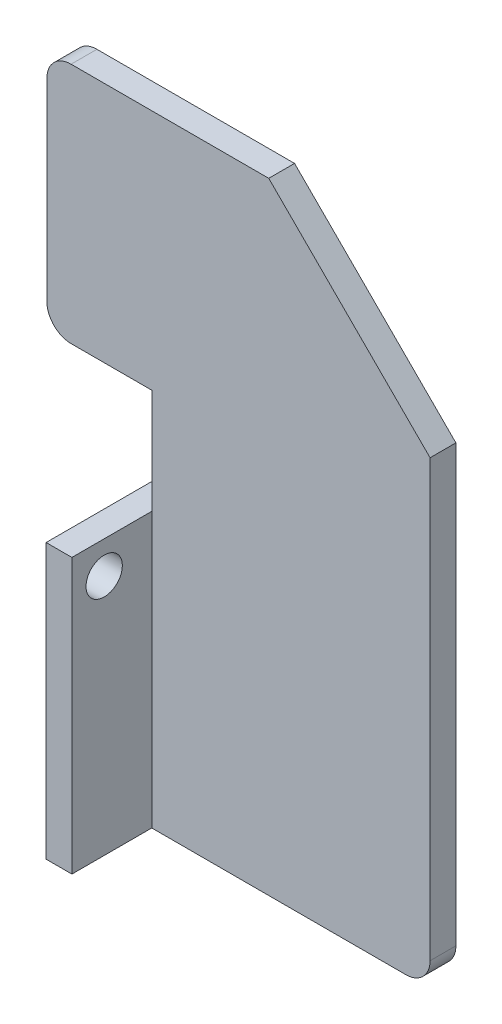
ISO-10303-21;
HEADER;
FILE_DESCRIPTION(('STEP AP214'),'2;1');
FILE_NAME('part.step','',(''),(''),'','','');
FILE_SCHEMA(('AUTOMOTIVE_DESIGN { 1 0 10303 214 1 1 1 1 }'));
ENDSEC;
DATA;
#1=APPLICATION_CONTEXT('core data for automotive mechanical design processes');
#2=APPLICATION_PROTOCOL_DEFINITION('international standard','automotive_design',2000,#1);
#3=PRODUCT_CONTEXT('',#1,'mechanical');
#4=PRODUCT('Part','Part','',(#3));
#5=PRODUCT_RELATED_PRODUCT_CATEGORY('part','',(#4));
#6=PRODUCT_DEFINITION_FORMATION('','',#4);
#7=PRODUCT_DEFINITION_CONTEXT('part definition',#1,'design');
#8=PRODUCT_DEFINITION('design','',#6,#7);
#9=PRODUCT_DEFINITION_SHAPE('','',#8);
#10=(LENGTH_UNIT() NAMED_UNIT(*) SI_UNIT(.MILLI.,.METRE.));
#11=(NAMED_UNIT(*) PLANE_ANGLE_UNIT() SI_UNIT($,.RADIAN.));
#12=(NAMED_UNIT(*) SI_UNIT($,.STERADIAN.) SOLID_ANGLE_UNIT());
#13=UNCERTAINTY_MEASURE_WITH_UNIT(LENGTH_MEASURE(1.E-05),#10,'distance_accuracy_value','');
#14=(GEOMETRIC_REPRESENTATION_CONTEXT(3) GLOBAL_UNCERTAINTY_ASSIGNED_CONTEXT((#13)) GLOBAL_UNIT_ASSIGNED_CONTEXT((#10,
#11,#12)) REPRESENTATION_CONTEXT('',''));
#15=CARTESIAN_POINT('',(0.,0.,0.));
#16=DIRECTION('',(0.,0.,1.));
#17=DIRECTION('',(1.,0.,0.));
#18=AXIS2_PLACEMENT_3D('',#15,#16,#17);
#19=CARTESIAN_POINT('',(3.2,47.,1.6));
#20=DIRECTION('',(1.,0.,0.));
#21=DIRECTION('',(0.,0.,-1.));
#22=AXIS2_PLACEMENT_3D('',#19,#20,#21);
#23=PLANE('',#22);
#24=DIRECTION('',(0.,0.,-1.));
#25=VECTOR('',#24,1.);
#26=CARTESIAN_POINT('',(3.2,34.,11.5));
#27=LINE('',#26,#25);
#28=CARTESIAN_POINT('',(3.2,34.,1.6));
#29=VERTEX_POINT('',#28);
#30=CARTESIAN_POINT('',(3.2,34.,-1.6));
#31=VERTEX_POINT('',#30);
#32=EDGE_CURVE('E55',#29,#31,#27,.T.);
#33=ORIENTED_EDGE('',*,*,#32,.F.);
#34=DIRECTION('',(0.,-1.,0.));
#35=VECTOR('',#34,1.);
#36=CARTESIAN_POINT('',(3.2,47.,1.6));
#37=LINE('',#36,#35);
#38=CARTESIAN_POINT('',(3.2,47.,1.6));
#39=VERTEX_POINT('',#38);
#40=EDGE_CURVE('E230',#39,#29,#37,.T.);
#41=ORIENTED_EDGE('',*,*,#40,.F.);
#42=DIRECTION('',(0.,0.,-1.));
#43=VECTOR('',#42,1.);
#44=CARTESIAN_POINT('',(3.2,47.,1.6));
#45=LINE('',#44,#43);
#46=CARTESIAN_POINT('',(3.2,47.,-1.6));
#47=VERTEX_POINT('',#46);
#48=EDGE_CURVE('E250',#39,#47,#45,.T.);
#49=ORIENTED_EDGE('',*,*,#48,.T.);
#50=DIRECTION('',(0.,-1.,0.));
#51=VECTOR('',#50,1.);
#52=CARTESIAN_POINT('',(3.2,47.,-1.6));
#53=LINE('',#52,#51);
#54=EDGE_CURVE('E201',#47,#31,#53,.T.);
#55=ORIENTED_EDGE('',*,*,#54,.T.);
#56=EDGE_LOOP('',(#33,#41,#49,#55));
#57=FACE_BOUND('',#56,.T.);
#58=ADVANCED_FACE('F39',(#57),#23,.F.);
#59=CARTESIAN_POINT('',(3.2,0.,1.6));
#60=DIRECTION('',(0.,1.,0.));
#61=DIRECTION('',(0.,0.,1.));
#62=AXIS2_PLACEMENT_3D('',#59,#60,#61);
#63=PLANE('',#62);
#64=DIRECTION('',(1.,0.,0.));
#65=VECTOR('',#64,1.);
#66=CARTESIAN_POINT('',(3.2,0.,1.6));
#67=LINE('',#66,#65);
#68=CARTESIAN_POINT('',(3.2,0.,1.6));
#69=VERTEX_POINT('',#68);
#70=CARTESIAN_POINT('',(34.7,0.,1.6));
#71=VERTEX_POINT('',#70);
#72=EDGE_CURVE('E232',#69,#71,#67,.T.);
#73=ORIENTED_EDGE('',*,*,#72,.F.);
#74=DIRECTION('',(0.,0.,-1.));
#75=VECTOR('',#74,1.);
#76=CARTESIAN_POINT('',(3.2,0.,11.5));
#77=LINE('',#76,#75);
#78=CARTESIAN_POINT('',(3.2,0.,11.5));
#79=VERTEX_POINT('',#78);
#80=EDGE_CURVE('E161',#79,#69,#77,.T.);
#81=ORIENTED_EDGE('',*,*,#80,.F.);
#82=DIRECTION('',(1.,0.,0.));
#83=VECTOR('',#82,1.);
#84=CARTESIAN_POINT('',(0.,0.,11.5));
#85=LINE('',#84,#83);
#86=CARTESIAN_POINT('',(0.,0.,11.5));
#87=VERTEX_POINT('',#86);
#88=EDGE_CURVE('E155',#87,#79,#85,.T.);
#89=ORIENTED_EDGE('',*,*,#88,.F.);
#90=DIRECTION('',(0.,0.,-1.));
#91=VECTOR('',#90,1.);
#92=CARTESIAN_POINT('',(0.,0.,11.5));
#93=LINE('',#92,#91);
#94=CARTESIAN_POINT('',(0.,0.,-11.5));
#95=VERTEX_POINT('',#94);
#96=EDGE_CURVE('E148',#87,#95,#93,.T.);
#97=ORIENTED_EDGE('',*,*,#96,.T.);
#98=DIRECTION('',(1.,0.,0.));
#99=VECTOR('',#98,1.);
#100=CARTESIAN_POINT('',(0.,0.,-11.5));
#101=LINE('',#100,#99);
#102=CARTESIAN_POINT('',(3.2,0.,-11.5));
#103=VERTEX_POINT('',#102);
#104=EDGE_CURVE('E153',#95,#103,#101,.T.);
#105=ORIENTED_EDGE('',*,*,#104,.T.);
#106=CARTESIAN_POINT('',(3.2,0.,-1.6));
#107=VERTEX_POINT('',#106);
#108=EDGE_CURVE('E197',#107,#103,#77,.T.);
#109=ORIENTED_EDGE('',*,*,#108,.F.);
#110=DIRECTION('',(1.,0.,0.));
#111=VECTOR('',#110,1.);
#112=CARTESIAN_POINT('',(3.2,0.,-1.6));
#113=LINE('',#112,#111);
#114=CARTESIAN_POINT('',(34.7,0.,-1.6));
#115=VERTEX_POINT('',#114);
#116=EDGE_CURVE('E203',#107,#115,#113,.T.);
#117=ORIENTED_EDGE('',*,*,#116,.T.);
#118=DIRECTION('',(0.,0.,-1.));
#119=VECTOR('',#118,1.);
#120=CARTESIAN_POINT('',(34.7,0.,1.6));
#121=LINE('',#120,#119);
#122=EDGE_CURVE('E11',#71,#115,#121,.T.);
#123=ORIENTED_EDGE('',*,*,#122,.F.);
#124=EDGE_LOOP('',(#73,#81,#89,#97,#105,#109,#117,#123));
#125=FACE_BOUND('',#124,.T.);
#126=ADVANCED_FACE('F151',(#125),#63,.F.);
#127=CARTESIAN_POINT('',(34.7,3.,1.6));
#128=DIRECTION('',(0.,0.,-1.));
#129=DIRECTION('',(-1.,0.,0.));
#130=AXIS2_PLACEMENT_3D('',#127,#128,#129);
#131=CYLINDRICAL_SURFACE('',#130,3.);
#132=ORIENTED_EDGE('',*,*,#122,.T.);
#133=CARTESIAN_POINT('',(34.7,3.,-1.6));
#134=DIRECTION('',(0.,0.,1.));
#135=DIRECTION('',(1.,0.,0.));
#136=AXIS2_PLACEMENT_3D('',#133,#134,#135);
#137=CIRCLE('',#136,3.);
#138=CARTESIAN_POINT('',(37.7,3.,-1.6));
#139=VERTEX_POINT('',#138);
#140=EDGE_CURVE('E206',#115,#139,#137,.T.);
#141=ORIENTED_EDGE('',*,*,#140,.T.);
#142=DIRECTION('',(0.,0.,-1.));
#143=VECTOR('',#142,1.);
#144=CARTESIAN_POINT('',(37.7,3.,1.6));
#145=LINE('',#144,#143);
#146=CARTESIAN_POINT('',(37.7,3.,1.6));
#147=VERTEX_POINT('',#146);
#148=EDGE_CURVE('E47',#147,#139,#145,.T.);
#149=ORIENTED_EDGE('',*,*,#148,.F.);
#150=CARTESIAN_POINT('',(34.7,3.,1.6));
#151=DIRECTION('',(0.,0.,1.));
#152=DIRECTION('',(1.,0.,0.));
#153=AXIS2_PLACEMENT_3D('',#150,#151,#152);
#154=CIRCLE('',#153,3.);
#155=EDGE_CURVE('E234',#71,#147,#154,.T.);
#156=ORIENTED_EDGE('',*,*,#155,.F.);
#157=EDGE_LOOP('',(#132,#141,#149,#156));
#158=FACE_BOUND('',#157,.T.);
#159=ADVANCED_FACE('F304',(#158),#131,.T.);
#160=CARTESIAN_POINT('',(37.7,3.,1.6));
#161=DIRECTION('',(-1.,0.,0.));
#162=DIRECTION('',(0.,0.,1.));
#163=AXIS2_PLACEMENT_3D('',#160,#161,#162);
#164=PLANE('',#163);
#165=ORIENTED_EDGE('',*,*,#148,.T.);
#166=DIRECTION('',(0.,1.,0.));
#167=VECTOR('',#166,1.);
#168=CARTESIAN_POINT('',(37.7,3.,-1.6));
#169=LINE('',#168,#167);
#170=CARTESIAN_POINT('',(37.7,57.,-1.6));
#171=VERTEX_POINT('',#170);
#172=EDGE_CURVE('E209',#139,#171,#169,.T.);
#173=ORIENTED_EDGE('',*,*,#172,.T.);
#174=DIRECTION('',(0.,0.,-1.));
#175=VECTOR('',#174,1.);
#176=CARTESIAN_POINT('',(37.7,57.,1.6));
#177=LINE('',#176,#175);
#178=CARTESIAN_POINT('',(37.7,57.,1.6));
#179=VERTEX_POINT('',#178);
#180=EDGE_CURVE('E262',#179,#171,#177,.T.);
#181=ORIENTED_EDGE('',*,*,#180,.F.);
#182=DIRECTION('',(0.,1.,0.));
#183=VECTOR('',#182,1.);
#184=CARTESIAN_POINT('',(37.7,3.,1.6));
#185=LINE('',#184,#183);
#186=EDGE_CURVE('E236',#147,#179,#185,.T.);
#187=ORIENTED_EDGE('',*,*,#186,.F.);
#188=EDGE_LOOP('',(#165,#173,#181,#187));
#189=FACE_BOUND('',#188,.T.);
#190=ADVANCED_FACE('F310',(#189),#164,.F.);
#191=CARTESIAN_POINT('',(37.7,57.,1.6));
#192=DIRECTION('',(-0.707106781186548,-0.707106781186548,0.));
#193=DIRECTION('',(0.707106781186548,-0.707106781186547,0.));
#194=AXIS2_PLACEMENT_3D('',#191,#192,#193);
#195=PLANE('',#194);
#196=ORIENTED_EDGE('',*,*,#180,.T.);
#197=DIRECTION('',(-0.707106781186548,0.707106781186547,0.));
#198=VECTOR('',#197,1.);
#199=CARTESIAN_POINT('',(37.7,57.,-1.6));
#200=LINE('',#199,#198);
#201=CARTESIAN_POINT('',(17.7,77.,-1.6));
#202=VERTEX_POINT('',#201);
#203=EDGE_CURVE('E212',#171,#202,#200,.T.);
#204=ORIENTED_EDGE('',*,*,#203,.T.);
#205=DIRECTION('',(0.,0.,-1.));
#206=VECTOR('',#205,1.);
#207=CARTESIAN_POINT('',(17.7,77.,1.6));
#208=LINE('',#207,#206);
#209=CARTESIAN_POINT('',(17.7,77.,1.6));
#210=VERTEX_POINT('',#209);
#211=EDGE_CURVE('E260',#210,#202,#208,.T.);
#212=ORIENTED_EDGE('',*,*,#211,.F.);
#213=DIRECTION('',(-0.707106781186548,0.707106781186547,0.));
#214=VECTOR('',#213,1.);
#215=CARTESIAN_POINT('',(37.7,57.,1.6));
#216=LINE('',#215,#214);
#217=EDGE_CURVE('E238',#179,#210,#216,.T.);
#218=ORIENTED_EDGE('',*,*,#217,.F.);
#219=EDGE_LOOP('',(#196,#204,#212,#218));
#220=FACE_BOUND('',#219,.T.);
#221=ADVANCED_FACE('F314',(#220),#195,.F.);
#222=CARTESIAN_POINT('',(17.7,77.,1.6));
#223=DIRECTION('',(0.,-1.,0.));
#224=DIRECTION('',(0.,0.,-1.));
#225=AXIS2_PLACEMENT_3D('',#222,#223,#224);
#226=PLANE('',#225);
#227=ORIENTED_EDGE('',*,*,#211,.T.);
#228=DIRECTION('',(-1.,0.,0.));
#229=VECTOR('',#228,1.);
#230=CARTESIAN_POINT('',(17.7,77.,-1.6));
#231=LINE('',#230,#229);
#232=CARTESIAN_POINT('',(-6.8,77.,-1.6));
#233=VERTEX_POINT('',#232);
#234=EDGE_CURVE('E215',#202,#233,#231,.T.);
#235=ORIENTED_EDGE('',*,*,#234,.T.);
#236=DIRECTION('',(0.,0.,-1.));
#237=VECTOR('',#236,1.);
#238=CARTESIAN_POINT('',(-6.8,77.,1.6));
#239=LINE('',#238,#237);
#240=CARTESIAN_POINT('',(-6.8,77.,1.6));
#241=VERTEX_POINT('',#240);
#242=EDGE_CURVE('E258',#241,#233,#239,.T.);
#243=ORIENTED_EDGE('',*,*,#242,.F.);
#244=DIRECTION('',(-1.,0.,0.));
#245=VECTOR('',#244,1.);
#246=CARTESIAN_POINT('',(17.7,77.,1.6));
#247=LINE('',#246,#245);
#248=EDGE_CURVE('E240',#210,#241,#247,.T.);
#249=ORIENTED_EDGE('',*,*,#248,.F.);
#250=EDGE_LOOP('',(#227,#235,#243,#249));
#251=FACE_BOUND('',#250,.T.);
#252=ADVANCED_FACE('F319',(#251),#226,.F.);
#253=CARTESIAN_POINT('',(-6.8,74.,1.6));
#254=DIRECTION('',(0.,0.,-1.));
#255=DIRECTION('',(-1.,0.,0.));
#256=AXIS2_PLACEMENT_3D('',#253,#254,#255);
#257=CYLINDRICAL_SURFACE('',#256,3.);
#258=ORIENTED_EDGE('',*,*,#242,.T.);
#259=CARTESIAN_POINT('',(-6.8,74.,-1.6));
#260=DIRECTION('',(0.,0.,1.));
#261=DIRECTION('',(1.,0.,0.));
#262=AXIS2_PLACEMENT_3D('',#259,#260,#261);
#263=CIRCLE('',#262,3.);
#264=CARTESIAN_POINT('',(-9.8,74.,-1.6));
#265=VERTEX_POINT('',#264);
#266=EDGE_CURVE('E218',#233,#265,#263,.T.);
#267=ORIENTED_EDGE('',*,*,#266,.T.);
#268=DIRECTION('',(0.,0.,-1.));
#269=VECTOR('',#268,1.);
#270=CARTESIAN_POINT('',(-9.8,74.,1.6));
#271=LINE('',#270,#269);
#272=CARTESIAN_POINT('',(-9.8,74.,1.6));
#273=VERTEX_POINT('',#272);
#274=EDGE_CURVE('E256',#273,#265,#271,.T.);
#275=ORIENTED_EDGE('',*,*,#274,.F.);
#276=CARTESIAN_POINT('',(-6.8,74.,1.6));
#277=DIRECTION('',(0.,0.,1.));
#278=DIRECTION('',(1.,0.,0.));
#279=AXIS2_PLACEMENT_3D('',#276,#277,#278);
#280=CIRCLE('',#279,3.);
#281=EDGE_CURVE('E242',#241,#273,#280,.T.);
#282=ORIENTED_EDGE('',*,*,#281,.F.);
#283=EDGE_LOOP('',(#258,#267,#275,#282));
#284=FACE_BOUND('',#283,.T.);
#285=ADVANCED_FACE('F325',(#284),#257,.T.);
#286=CARTESIAN_POINT('',(-9.8,74.,1.6));
#287=DIRECTION('',(1.,0.,0.));
#288=DIRECTION('',(0.,0.,-1.));
#289=AXIS2_PLACEMENT_3D('',#286,#287,#288);
#290=PLANE('',#289);
#291=ORIENTED_EDGE('',*,*,#274,.T.);
#292=DIRECTION('',(0.,-1.,0.));
#293=VECTOR('',#292,1.);
#294=CARTESIAN_POINT('',(-9.8,74.,-1.6));
#295=LINE('',#294,#293);
#296=CARTESIAN_POINT('',(-9.8,50.,-1.6));
#297=VERTEX_POINT('',#296);
#298=EDGE_CURVE('E221',#265,#297,#295,.T.);
#299=ORIENTED_EDGE('',*,*,#298,.T.);
#300=DIRECTION('',(0.,0.,-1.));
#301=VECTOR('',#300,1.);
#302=CARTESIAN_POINT('',(-9.8,50.,1.6));
#303=LINE('',#302,#301);
#304=CARTESIAN_POINT('',(-9.8,50.,1.6));
#305=VERTEX_POINT('',#304);
#306=EDGE_CURVE('E254',#305,#297,#303,.T.);
#307=ORIENTED_EDGE('',*,*,#306,.F.);
#308=DIRECTION('',(0.,-1.,0.));
#309=VECTOR('',#308,1.);
#310=CARTESIAN_POINT('',(-9.8,74.,1.6));
#311=LINE('',#310,#309);
#312=EDGE_CURVE('E244',#273,#305,#311,.T.);
#313=ORIENTED_EDGE('',*,*,#312,.F.);
#314=EDGE_LOOP('',(#291,#299,#307,#313));
#315=FACE_BOUND('',#314,.T.);
#316=ADVANCED_FACE('F329',(#315),#290,.F.);
#317=CARTESIAN_POINT('',(-6.8,50.,1.6));
#318=DIRECTION('',(0.,0.,-1.));
#319=DIRECTION('',(-1.,0.,0.));
#320=AXIS2_PLACEMENT_3D('',#317,#318,#319);
#321=CYLINDRICAL_SURFACE('',#320,3.);
#322=ORIENTED_EDGE('',*,*,#306,.T.);
#323=CARTESIAN_POINT('',(-6.8,50.,-1.6));
#324=DIRECTION('',(0.,0.,1.));
#325=DIRECTION('',(1.,0.,0.));
#326=AXIS2_PLACEMENT_3D('',#323,#324,#325);
#327=CIRCLE('',#326,3.);
#328=CARTESIAN_POINT('',(-6.8,47.,-1.6));
#329=VERTEX_POINT('',#328);
#330=EDGE_CURVE('E224',#297,#329,#327,.T.);
#331=ORIENTED_EDGE('',*,*,#330,.T.);
#332=DIRECTION('',(0.,0.,-1.));
#333=VECTOR('',#332,1.);
#334=CARTESIAN_POINT('',(-6.8,47.,1.6));
#335=LINE('',#334,#333);
#336=CARTESIAN_POINT('',(-6.8,47.,1.6));
#337=VERTEX_POINT('',#336);
#338=EDGE_CURVE('E252',#337,#329,#335,.T.);
#339=ORIENTED_EDGE('',*,*,#338,.F.);
#340=CARTESIAN_POINT('',(-6.8,50.,1.6));
#341=DIRECTION('',(0.,0.,1.));
#342=DIRECTION('',(1.,0.,0.));
#343=AXIS2_PLACEMENT_3D('',#340,#341,#342);
#344=CIRCLE('',#343,3.);
#345=EDGE_CURVE('E246',#305,#337,#344,.T.);
#346=ORIENTED_EDGE('',*,*,#345,.F.);
#347=EDGE_LOOP('',(#322,#331,#339,#346));
#348=FACE_BOUND('',#347,.T.);
#349=ADVANCED_FACE('F334',(#348),#321,.T.);
#350=CARTESIAN_POINT('',(-6.8,47.,1.6));
#351=DIRECTION('',(0.,1.,0.));
#352=DIRECTION('',(0.,0.,1.));
#353=AXIS2_PLACEMENT_3D('',#350,#351,#352);
#354=PLANE('',#353);
#355=ORIENTED_EDGE('',*,*,#338,.T.);
#356=DIRECTION('',(1.,0.,0.));
#357=VECTOR('',#356,1.);
#358=CARTESIAN_POINT('',(-6.8,47.,-1.6));
#359=LINE('',#358,#357);
#360=EDGE_CURVE('E227',#329,#47,#359,.T.);
#361=ORIENTED_EDGE('',*,*,#360,.T.);
#362=ORIENTED_EDGE('',*,*,#48,.F.);
#363=DIRECTION('',(1.,0.,0.));
#364=VECTOR('',#363,1.);
#365=CARTESIAN_POINT('',(-6.8,47.,1.6));
#366=LINE('',#365,#364);
#367=EDGE_CURVE('E248',#337,#39,#366,.T.);
#368=ORIENTED_EDGE('',*,*,#367,.F.);
#369=EDGE_LOOP('',(#355,#361,#362,#368));
#370=FACE_BOUND('',#369,.T.);
#371=ADVANCED_FACE('F338',(#370),#354,.F.);
#372=CARTESIAN_POINT('',(34.7,3.,1.6));
#373=DIRECTION('',(0.,0.,1.));
#374=DIRECTION('',(1.,0.,0.));
#375=AXIS2_PLACEMENT_3D('',#372,#373,#374);
#376=PLANE('',#375);
#377=ORIENTED_EDGE('',*,*,#40,.T.);
#378=DIRECTION('',(0.,-1.,0.));
#379=VECTOR('',#378,1.);
#380=CARTESIAN_POINT('',(3.2,3.,1.6));
#381=LINE('',#380,#379);
#382=EDGE_CURVE('E160',#29,#69,#381,.T.);
#383=ORIENTED_EDGE('',*,*,#382,.T.);
#384=ORIENTED_EDGE('',*,*,#72,.T.);
#385=ORIENTED_EDGE('',*,*,#155,.T.);
#386=ORIENTED_EDGE('',*,*,#186,.T.);
#387=ORIENTED_EDGE('',*,*,#217,.T.);
#388=ORIENTED_EDGE('',*,*,#248,.T.);
#389=ORIENTED_EDGE('',*,*,#281,.T.);
#390=ORIENTED_EDGE('',*,*,#312,.T.);
#391=ORIENTED_EDGE('',*,*,#345,.T.);
#392=ORIENTED_EDGE('',*,*,#367,.T.);
#393=EDGE_LOOP('',(#377,#383,#384,#385,#386,#387,#388,#389,#390,#391,#392));
#394=FACE_BOUND('',#393,.T.);
#395=ADVANCED_FACE('F298',(#394),#376,.T.);
#396=CARTESIAN_POINT('',(34.7,3.,-1.6));
#397=DIRECTION('',(0.,0.,1.));
#398=DIRECTION('',(1.,0.,0.));
#399=AXIS2_PLACEMENT_3D('',#396,#397,#398);
#400=PLANE('',#399);
#401=ORIENTED_EDGE('',*,*,#54,.F.);
#402=ORIENTED_EDGE('',*,*,#360,.F.);
#403=ORIENTED_EDGE('',*,*,#330,.F.);
#404=ORIENTED_EDGE('',*,*,#298,.F.);
#405=ORIENTED_EDGE('',*,*,#266,.F.);
#406=ORIENTED_EDGE('',*,*,#234,.F.);
#407=ORIENTED_EDGE('',*,*,#203,.F.);
#408=ORIENTED_EDGE('',*,*,#172,.F.);
#409=ORIENTED_EDGE('',*,*,#140,.F.);
#410=ORIENTED_EDGE('',*,*,#116,.F.);
#411=EDGE_CURVE('E63',#31,#107,#53,.T.);
#412=ORIENTED_EDGE('',*,*,#411,.F.);
#413=EDGE_LOOP('',(#401,#402,#403,#404,#405,#406,#407,#408,#409,#410,#412));
#414=FACE_BOUND('',#413,.T.);
#415=ADVANCED_FACE('F286',(#414),#400,.F.);
#416=CARTESIAN_POINT('',(3.2,0.,11.5));
#417=DIRECTION('',(-1.,0.,0.));
#418=DIRECTION('',(0.,0.,1.));
#419=AXIS2_PLACEMENT_3D('',#416,#417,#418);
#420=PLANE('',#419);
#421=CARTESIAN_POINT('',(3.2,4.,-7.5));
#422=DIRECTION('',(-1.,0.,0.));
#423=DIRECTION('',(0.,0.,1.));
#424=AXIS2_PLACEMENT_3D('',#421,#422,#423);
#425=CIRCLE('',#424,2.25);
#426=CARTESIAN_POINT('',(3.2,4.,-5.25));
#427=VERTEX_POINT('',#426);
#428=EDGE_CURVE('E176',#427,#427,#425,.T.);
#429=ORIENTED_EDGE('',*,*,#428,.T.);
#430=EDGE_LOOP('',(#429));
#431=FACE_BOUND('',#430,.T.);
#432=CARTESIAN_POINT('',(3.2,34.,-11.5));
#433=VERTEX_POINT('',#432);
#434=EDGE_CURVE('E193',#31,#433,#27,.T.);
#435=ORIENTED_EDGE('',*,*,#434,.F.);
#436=ORIENTED_EDGE('',*,*,#411,.T.);
#437=ORIENTED_EDGE('',*,*,#108,.T.);
#438=DIRECTION('',(0.,1.,0.));
#439=VECTOR('',#438,1.);
#440=CARTESIAN_POINT('',(3.2,0.,-11.5));
#441=LINE('',#440,#439);
#442=EDGE_CURVE('E171',#103,#433,#441,.T.);
#443=ORIENTED_EDGE('',*,*,#442,.T.);
#444=EDGE_LOOP('',(#435,#436,#437,#443));
#445=FACE_BOUND('',#444,.T.);
#446=ADVANCED_FACE('F283',(#431,#445),#420,.F.);
#447=CARTESIAN_POINT('',(0.,0.,11.5));
#448=DIRECTION('',(1.,0.,0.));
#449=DIRECTION('',(0.,0.,-1.));
#450=AXIS2_PLACEMENT_3D('',#447,#448,#449);
#451=PLANE('',#450);
#452=CARTESIAN_POINT('',(0.,30.,7.5));
#453=DIRECTION('',(1.,0.,0.));
#454=DIRECTION('',(0.,0.,-1.));
#455=AXIS2_PLACEMENT_3D('',#452,#453,#454);
#456=CIRCLE('',#455,2.25);
#457=CARTESIAN_POINT('',(0.,30.,5.25));
#458=VERTEX_POINT('',#457);
#459=EDGE_CURVE('E266',#458,#458,#456,.T.);
#460=ORIENTED_EDGE('',*,*,#459,.T.);
#461=EDGE_LOOP('',(#460));
#462=FACE_BOUND('',#461,.T.);
#463=CARTESIAN_POINT('',(0.,4.,-7.5));
#464=DIRECTION('',(1.,0.,0.));
#465=DIRECTION('',(0.,0.,-1.));
#466=AXIS2_PLACEMENT_3D('',#463,#464,#465);
#467=CIRCLE('',#466,2.25);
#468=CARTESIAN_POINT('',(0.,4.,-9.75));
#469=VERTEX_POINT('',#468);
#470=EDGE_CURVE('E42',#469,#469,#467,.T.);
#471=ORIENTED_EDGE('',*,*,#470,.T.);
#472=EDGE_LOOP('',(#471));
#473=FACE_BOUND('',#472,.T.);
#474=DIRECTION('',(0.,0.,-1.));
#475=VECTOR('',#474,1.);
#476=CARTESIAN_POINT('',(0.,34.,11.5));
#477=LINE('',#476,#475);
#478=CARTESIAN_POINT('',(0.,34.,11.5));
#479=VERTEX_POINT('',#478);
#480=CARTESIAN_POINT('',(0.,34.,-11.5));
#481=VERTEX_POINT('',#480);
#482=EDGE_CURVE('E175',#479,#481,#477,.T.);
#483=ORIENTED_EDGE('',*,*,#482,.T.);
#484=DIRECTION('',(0.,-1.,0.));
#485=VECTOR('',#484,1.);
#486=CARTESIAN_POINT('',(0.,0.,-11.5));
#487=LINE('',#486,#485);
#488=EDGE_CURVE('E168',#481,#95,#487,.T.);
#489=ORIENTED_EDGE('',*,*,#488,.T.);
#490=ORIENTED_EDGE('',*,*,#96,.F.);
#491=DIRECTION('',(0.,-1.,0.));
#492=VECTOR('',#491,1.);
#493=CARTESIAN_POINT('',(0.,0.,11.5));
#494=LINE('',#493,#492);
#495=EDGE_CURVE('E185',#479,#87,#494,.T.);
#496=ORIENTED_EDGE('',*,*,#495,.F.);
#497=EDGE_LOOP('',(#483,#489,#490,#496));
#498=FACE_BOUND('',#497,.T.);
#499=ADVANCED_FACE('F173',(#462,#473,#498),#451,.F.);
#500=CARTESIAN_POINT('',(3.2,30.,7.5));
#501=DIRECTION('',(-1.,0.,0.));
#502=DIRECTION('',(0.,0.,1.));
#503=AXIS2_PLACEMENT_3D('',#500,#501,#502);
#504=CIRCLE('',#503,2.25);
#505=CARTESIAN_POINT('',(3.2,30.,9.75));
#506=VERTEX_POINT('',#505);
#507=EDGE_CURVE('E264',#506,#506,#504,.T.);
#508=ORIENTED_EDGE('',*,*,#507,.T.);
#509=EDGE_LOOP('',(#508));
#510=FACE_BOUND('',#509,.T.);
#511=ORIENTED_EDGE('',*,*,#382,.F.);
#512=CARTESIAN_POINT('',(3.2,34.,11.5));
#513=VERTEX_POINT('',#512);
#514=EDGE_CURVE('E194',#513,#29,#27,.T.);
#515=ORIENTED_EDGE('',*,*,#514,.F.);
#516=DIRECTION('',(0.,1.,0.));
#517=VECTOR('',#516,1.);
#518=CARTESIAN_POINT('',(3.2,0.,11.5));
#519=LINE('',#518,#517);
#520=EDGE_CURVE('E188',#79,#513,#519,.T.);
#521=ORIENTED_EDGE('',*,*,#520,.F.);
#522=ORIENTED_EDGE('',*,*,#80,.T.);
#523=EDGE_LOOP('',(#511,#515,#521,#522));
#524=FACE_BOUND('',#523,.T.);
#525=ADVANCED_FACE('F288',(#510,#524),#420,.F.);
#526=CARTESIAN_POINT('',(0.,34.,11.5));
#527=DIRECTION('',(0.,-1.,0.));
#528=DIRECTION('',(0.,0.,-1.));
#529=AXIS2_PLACEMENT_3D('',#526,#527,#528);
#530=PLANE('',#529);
#531=ORIENTED_EDGE('',*,*,#514,.T.);
#532=ORIENTED_EDGE('',*,*,#32,.T.);
#533=ORIENTED_EDGE('',*,*,#434,.T.);
#534=DIRECTION('',(-1.,0.,0.));
#535=VECTOR('',#534,1.);
#536=CARTESIAN_POINT('',(0.,34.,-11.5));
#537=LINE('',#536,#535);
#538=EDGE_CURVE('E183',#433,#481,#537,.T.);
#539=ORIENTED_EDGE('',*,*,#538,.T.);
#540=ORIENTED_EDGE('',*,*,#482,.F.);
#541=DIRECTION('',(-1.,0.,0.));
#542=VECTOR('',#541,1.);
#543=CARTESIAN_POINT('',(0.,34.,11.5));
#544=LINE('',#543,#542);
#545=EDGE_CURVE('E190',#513,#479,#544,.T.);
#546=ORIENTED_EDGE('',*,*,#545,.F.);
#547=EDGE_LOOP('',(#531,#532,#533,#539,#540,#546));
#548=FACE_BOUND('',#547,.T.);
#549=ADVANCED_FACE('F291',(#548),#530,.F.);
#550=CARTESIAN_POINT('',(0.,0.,11.5));
#551=DIRECTION('',(0.,0.,-1.));
#552=DIRECTION('',(-1.,0.,0.));
#553=AXIS2_PLACEMENT_3D('',#550,#551,#552);
#554=PLANE('',#553);
#555=ORIENTED_EDGE('',*,*,#495,.T.);
#556=ORIENTED_EDGE('',*,*,#88,.T.);
#557=ORIENTED_EDGE('',*,*,#520,.T.);
#558=ORIENTED_EDGE('',*,*,#545,.T.);
#559=EDGE_LOOP('',(#555,#556,#557,#558));
#560=FACE_BOUND('',#559,.T.);
#561=ADVANCED_FACE('F372',(#560),#554,.F.);
#562=CARTESIAN_POINT('',(0.,0.,-11.5));
#563=DIRECTION('',(0.,0.,-1.));
#564=DIRECTION('',(-1.,0.,0.));
#565=AXIS2_PLACEMENT_3D('',#562,#563,#564);
#566=PLANE('',#565);
#567=ORIENTED_EDGE('',*,*,#488,.F.);
#568=ORIENTED_EDGE('',*,*,#538,.F.);
#569=ORIENTED_EDGE('',*,*,#442,.F.);
#570=ORIENTED_EDGE('',*,*,#104,.F.);
#571=EDGE_LOOP('',(#567,#568,#569,#570));
#572=FACE_BOUND('',#571,.T.);
#573=ADVANCED_FACE('F166',(#572),#566,.T.);
#574=CARTESIAN_POINT('',(-9.8,30.,7.5));
#575=DIRECTION('',(1.,0.,0.));
#576=DIRECTION('',(0.,0.,-1.));
#577=AXIS2_PLACEMENT_3D('',#574,#575,#576);
#578=CYLINDRICAL_SURFACE('',#577,2.25);
#579=ORIENTED_EDGE('',*,*,#507,.F.);
#580=EDGE_LOOP('',(#579));
#581=FACE_BOUND('',#580,.T.);
#582=ORIENTED_EDGE('',*,*,#459,.F.);
#583=EDGE_LOOP('',(#582));
#584=FACE_BOUND('',#583,.T.);
#585=ADVANCED_FACE('F279',(#581,#584),#578,.F.);
#586=CARTESIAN_POINT('',(-9.8,4.,-7.5));
#587=DIRECTION('',(1.,0.,0.));
#588=DIRECTION('',(0.,0.,-1.));
#589=AXIS2_PLACEMENT_3D('',#586,#587,#588);
#590=CYLINDRICAL_SURFACE('',#589,2.25);
#591=ORIENTED_EDGE('',*,*,#470,.F.);
#592=EDGE_LOOP('',(#591));
#593=FACE_BOUND('',#592,.T.);
#594=ORIENTED_EDGE('',*,*,#428,.F.);
#595=EDGE_LOOP('',(#594));
#596=FACE_BOUND('',#595,.T.);
#597=ADVANCED_FACE('F276',(#593,#596),#590,.F.);
#598=CLOSED_SHELL('',(#58,#126,#159,#190,#221,#252,#285,#316,#349,#371,#395,#415,#446,#499,#525,
#549,#561,#573,#585,#597));
#599=MANIFOLD_SOLID_BREP('B2',#598);
#600=ADVANCED_BREP_SHAPE_REPRESENTATION('',(#18,#599),#14);
#601=SHAPE_DEFINITION_REPRESENTATION(#9,#600);
ENDSEC;
END-ISO-10303-21;
